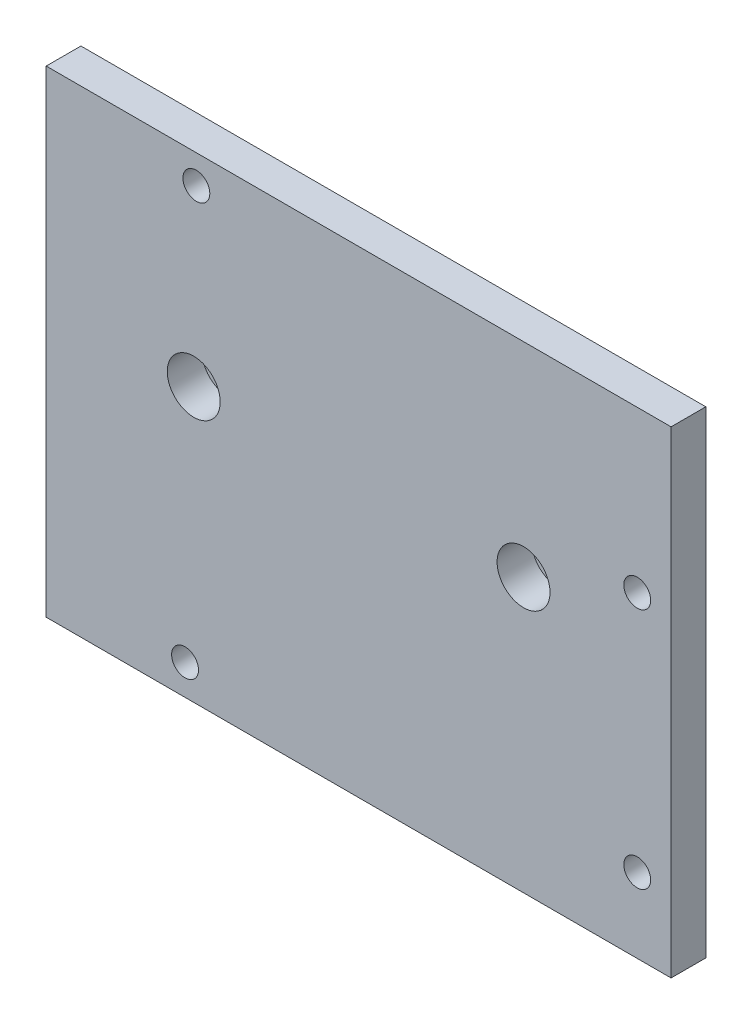
ISO-10303-21;
HEADER;
FILE_DESCRIPTION(('STEP AP214'),'2;1');
FILE_NAME('part.step','',(''),(''),'','','');
FILE_SCHEMA(('AUTOMOTIVE_DESIGN { 1 0 10303 214 1 1 1 1 }'));
ENDSEC;
DATA;
#1=APPLICATION_CONTEXT('core data for automotive mechanical design processes');
#2=APPLICATION_PROTOCOL_DEFINITION('international standard','automotive_design',2000,#1);
#3=PRODUCT_CONTEXT('',#1,'mechanical');
#4=PRODUCT('Part','Part','',(#3));
#5=PRODUCT_RELATED_PRODUCT_CATEGORY('part','',(#4));
#6=PRODUCT_DEFINITION_FORMATION('','',#4);
#7=PRODUCT_DEFINITION_CONTEXT('part definition',#1,'design');
#8=PRODUCT_DEFINITION('design','',#6,#7);
#9=PRODUCT_DEFINITION_SHAPE('','',#8);
#10=(LENGTH_UNIT() NAMED_UNIT(*) SI_UNIT(.MILLI.,.METRE.));
#11=(NAMED_UNIT(*) PLANE_ANGLE_UNIT() SI_UNIT($,.RADIAN.));
#12=(NAMED_UNIT(*) SI_UNIT($,.STERADIAN.) SOLID_ANGLE_UNIT());
#13=UNCERTAINTY_MEASURE_WITH_UNIT(LENGTH_MEASURE(1.E-05),#10,'distance_accuracy_value','');
#14=(GEOMETRIC_REPRESENTATION_CONTEXT(3) GLOBAL_UNCERTAINTY_ASSIGNED_CONTEXT((#13)) GLOBAL_UNIT_ASSIGNED_CONTEXT((#10,
#11,#12)) REPRESENTATION_CONTEXT('',''));
#15=CARTESIAN_POINT('',(0.,0.,0.));
#16=DIRECTION('',(0.,0.,1.));
#17=DIRECTION('',(1.,0.,0.));
#18=AXIS2_PLACEMENT_3D('',#15,#16,#17);
#19=CARTESIAN_POINT('',(0.,0.,6.));
#20=DIRECTION('',(0.,0.,-1.));
#21=DIRECTION('',(-1.,0.,0.));
#22=AXIS2_PLACEMENT_3D('',#19,#20,#21);
#23=PLANE('',#22);
#24=CARTESIAN_POINT('',(19.,0.,6.));
#25=DIRECTION('',(0.,0.,1.));
#26=DIRECTION('',(1.,0.,0.));
#27=AXIS2_PLACEMENT_3D('',#24,#25,#26);
#28=CIRCLE('',#27,1.55);
#29=CARTESIAN_POINT('',(20.55,0.,6.));
#30=VERTEX_POINT('',#29);
#31=EDGE_CURVE('E179',#30,#30,#28,.T.);
#32=ORIENTED_EDGE('',*,*,#31,.F.);
#33=EDGE_LOOP('',(#32));
#34=FACE_BOUND('',#33,.T.);
#35=CARTESIAN_POINT('',(19.,0.,6.));
#36=DIRECTION('',(0.,0.,1.));
#37=DIRECTION('',(1.,0.,0.));
#38=AXIS2_PLACEMENT_3D('',#35,#36,#37);
#39=CIRCLE('',#38,3.05);
#40=CARTESIAN_POINT('',(22.05,0.,6.));
#41=VERTEX_POINT('',#40);
#42=EDGE_CURVE('E167',#41,#41,#39,.T.);
#43=ORIENTED_EDGE('',*,*,#42,.T.);
#44=EDGE_LOOP('',(#43));
#45=FACE_BOUND('',#44,.T.);
#46=ADVANCED_FACE('F34',(#34,#45),#23,.F.);
#47=CARTESIAN_POINT('',(-19.,0.,6.));
#48=DIRECTION('',(0.,0.,1.));
#49=DIRECTION('',(1.,0.,0.));
#50=AXIS2_PLACEMENT_3D('',#47,#48,#49);
#51=CIRCLE('',#50,1.55);
#52=CARTESIAN_POINT('',(-17.45,0.,6.));
#53=VERTEX_POINT('',#52);
#54=EDGE_CURVE('E185',#53,#53,#51,.T.);
#55=ORIENTED_EDGE('',*,*,#54,.F.);
#56=EDGE_LOOP('',(#55));
#57=FACE_BOUND('',#56,.T.);
#58=CARTESIAN_POINT('',(-19.,0.,6.));
#59=DIRECTION('',(0.,0.,1.));
#60=DIRECTION('',(1.,0.,0.));
#61=AXIS2_PLACEMENT_3D('',#58,#59,#60);
#62=CIRCLE('',#61,3.05);
#63=CARTESIAN_POINT('',(-15.95,0.,6.));
#64=VERTEX_POINT('',#63);
#65=EDGE_CURVE('E170',#64,#64,#62,.T.);
#66=ORIENTED_EDGE('',*,*,#65,.T.);
#67=EDGE_LOOP('',(#66));
#68=FACE_BOUND('',#67,.T.);
#69=ADVANCED_FACE('F234',(#57,#68),#23,.F.);
#70=CARTESIAN_POINT('',(0.,0.,0.));
#71=DIRECTION('',(0.,0.,-1.));
#72=DIRECTION('',(-1.,0.,0.));
#73=AXIS2_PLACEMENT_3D('',#70,#71,#72);
#74=PLANE('',#73);
#75=CARTESIAN_POINT('',(-19.,0.,0.));
#76=DIRECTION('',(0.,0.,1.));
#77=DIRECTION('',(1.,0.,0.));
#78=AXIS2_PLACEMENT_3D('',#75,#76,#77);
#79=CIRCLE('',#78,1.55);
#80=CARTESIAN_POINT('',(-17.45,0.,0.));
#81=VERTEX_POINT('',#80);
#82=EDGE_CURVE('E182',#81,#81,#79,.T.);
#83=ORIENTED_EDGE('',*,*,#82,.T.);
#84=EDGE_LOOP('',(#83));
#85=FACE_BOUND('',#84,.T.);
#86=DIRECTION('',(0.,1.,0.));
#87=VECTOR('',#86,1.);
#88=CARTESIAN_POINT('',(29.,-6.,0.));
#89=LINE('',#88,#87);
#90=CARTESIAN_POINT('',(29.,-6.,0.));
#91=VERTEX_POINT('',#90);
#92=CARTESIAN_POINT('',(29.,6.,0.));
#93=VERTEX_POINT('',#92);
#94=EDGE_CURVE('E188',#91,#93,#89,.T.);
#95=ORIENTED_EDGE('',*,*,#94,.F.);
#96=DIRECTION('',(1.,0.,0.));
#97=VECTOR('',#96,1.);
#98=CARTESIAN_POINT('',(-29.,-6.,0.));
#99=LINE('',#98,#97);
#100=CARTESIAN_POINT('',(-29.,-6.,0.));
#101=VERTEX_POINT('',#100);
#102=EDGE_CURVE('E72',#101,#91,#99,.T.);
#103=ORIENTED_EDGE('',*,*,#102,.F.);
#104=DIRECTION('',(0.,-1.,0.));
#105=VECTOR('',#104,1.);
#106=CARTESIAN_POINT('',(-29.,-6.,0.));
#107=LINE('',#106,#105);
#108=CARTESIAN_POINT('',(-29.,6.,0.));
#109=VERTEX_POINT('',#108);
#110=EDGE_CURVE('E67',#109,#101,#107,.T.);
#111=ORIENTED_EDGE('',*,*,#110,.F.);
#112=DIRECTION('',(-1.,0.,0.));
#113=VECTOR('',#112,1.);
#114=CARTESIAN_POINT('',(-29.,6.,0.));
#115=LINE('',#114,#113);
#116=EDGE_CURVE('E204',#93,#109,#115,.T.);
#117=ORIENTED_EDGE('',*,*,#116,.F.);
#118=EDGE_LOOP('',(#95,#103,#111,#117));
#119=FACE_BOUND('',#118,.T.);
#120=CARTESIAN_POINT('',(19.,0.,0.));
#121=DIRECTION('',(0.,0.,1.));
#122=DIRECTION('',(1.,0.,0.));
#123=AXIS2_PLACEMENT_3D('',#120,#121,#122);
#124=CIRCLE('',#123,1.55);
#125=CARTESIAN_POINT('',(20.55,0.,0.));
#126=VERTEX_POINT('',#125);
#127=EDGE_CURVE('E118',#126,#126,#124,.T.);
#128=ORIENTED_EDGE('',*,*,#127,.T.);
#129=EDGE_LOOP('',(#128));
#130=FACE_BOUND('',#129,.T.);
#131=ADVANCED_FACE('F212',(#85,#119,#130),#74,.T.);
#132=CARTESIAN_POINT('',(29.,-6.,6.));
#133=DIRECTION('',(-1.,0.,0.));
#134=DIRECTION('',(0.,0.,1.));
#135=AXIS2_PLACEMENT_3D('',#132,#133,#134);
#136=PLANE('',#135);
#137=ORIENTED_EDGE('',*,*,#94,.T.);
#138=DIRECTION('',(0.,0.,-1.));
#139=VECTOR('',#138,1.);
#140=CARTESIAN_POINT('',(29.,6.,6.));
#141=LINE('',#140,#139);
#142=CARTESIAN_POINT('',(29.,6.,6.));
#143=VERTEX_POINT('',#142);
#144=EDGE_CURVE('E11',#143,#93,#141,.T.);
#145=ORIENTED_EDGE('',*,*,#144,.F.);
#146=DIRECTION('',(0.,1.,0.));
#147=VECTOR('',#146,1.);
#148=CARTESIAN_POINT('',(29.,-6.,6.));
#149=LINE('',#148,#147);
#150=CARTESIAN_POINT('',(29.,-6.,6.));
#151=VERTEX_POINT('',#150);
#152=EDGE_CURVE('E191',#151,#143,#149,.T.);
#153=ORIENTED_EDGE('',*,*,#152,.F.);
#154=DIRECTION('',(0.,0.,-1.));
#155=VECTOR('',#154,1.);
#156=CARTESIAN_POINT('',(29.,-6.,6.));
#157=LINE('',#156,#155);
#158=EDGE_CURVE('E201',#151,#91,#157,.T.);
#159=ORIENTED_EDGE('',*,*,#158,.T.);
#160=EDGE_LOOP('',(#137,#145,#153,#159));
#161=FACE_BOUND('',#160,.T.);
#162=ADVANCED_FACE('F36',(#161),#136,.F.);
#163=CARTESIAN_POINT('',(-29.,6.,6.));
#164=DIRECTION('',(0.,-1.,0.));
#165=DIRECTION('',(0.,0.,-1.));
#166=AXIS2_PLACEMENT_3D('',#163,#164,#165);
#167=PLANE('',#166);
#168=ORIENTED_EDGE('',*,*,#116,.T.);
#169=DIRECTION('',(0.,0.,-1.));
#170=VECTOR('',#169,1.);
#171=CARTESIAN_POINT('',(-29.,6.,6.));
#172=LINE('',#171,#170);
#173=CARTESIAN_POINT('',(-29.,6.,6.));
#174=VERTEX_POINT('',#173);
#175=EDGE_CURVE('E43',#174,#109,#172,.T.);
#176=ORIENTED_EDGE('',*,*,#175,.F.);
#177=DIRECTION('',(-1.,0.,0.));
#178=VECTOR('',#177,1.);
#179=CARTESIAN_POINT('',(-29.,6.,6.));
#180=LINE('',#179,#178);
#181=EDGE_CURVE('E77',#143,#174,#180,.T.);
#182=ORIENTED_EDGE('',*,*,#181,.F.);
#183=ORIENTED_EDGE('',*,*,#144,.T.);
#184=EDGE_LOOP('',(#168,#176,#182,#183));
#185=FACE_BOUND('',#184,.T.);
#186=ADVANCED_FACE('F251',(#185),#167,.F.);
#187=CARTESIAN_POINT('',(-29.,-6.,6.));
#188=DIRECTION('',(1.,0.,0.));
#189=DIRECTION('',(0.,0.,-1.));
#190=AXIS2_PLACEMENT_3D('',#187,#188,#189);
#191=PLANE('',#190);
#192=ORIENTED_EDGE('',*,*,#110,.T.);
#193=DIRECTION('',(0.,0.,-1.));
#194=VECTOR('',#193,1.);
#195=CARTESIAN_POINT('',(-29.,-6.,6.));
#196=LINE('',#195,#194);
#197=CARTESIAN_POINT('',(-29.,-6.,6.));
#198=VERTEX_POINT('',#197);
#199=EDGE_CURVE('E51',#198,#101,#196,.T.);
#200=ORIENTED_EDGE('',*,*,#199,.F.);
#201=DIRECTION('',(0.,-1.,0.));
#202=VECTOR('',#201,1.);
#203=CARTESIAN_POINT('',(-29.,-6.,6.));
#204=LINE('',#203,#202);
#205=EDGE_CURVE('E195',#174,#198,#204,.T.);
#206=ORIENTED_EDGE('',*,*,#205,.F.);
#207=ORIENTED_EDGE('',*,*,#175,.T.);
#208=EDGE_LOOP('',(#192,#200,#206,#207));
#209=FACE_BOUND('',#208,.T.);
#210=ADVANCED_FACE('F209',(#209),#191,.F.);
#211=CARTESIAN_POINT('',(-29.,-6.,6.));
#212=DIRECTION('',(0.,1.,0.));
#213=DIRECTION('',(0.,0.,1.));
#214=AXIS2_PLACEMENT_3D('',#211,#212,#213);
#215=PLANE('',#214);
#216=ORIENTED_EDGE('',*,*,#102,.T.);
#217=ORIENTED_EDGE('',*,*,#158,.F.);
#218=DIRECTION('',(1.,0.,0.));
#219=VECTOR('',#218,1.);
#220=CARTESIAN_POINT('',(-29.,-6.,6.));
#221=LINE('',#220,#219);
#222=EDGE_CURVE('E198',#198,#151,#221,.T.);
#223=ORIENTED_EDGE('',*,*,#222,.F.);
#224=ORIENTED_EDGE('',*,*,#199,.T.);
#225=EDGE_LOOP('',(#216,#217,#223,#224));
#226=FACE_BOUND('',#225,.T.);
#227=ADVANCED_FACE('F215',(#226),#215,.F.);
#228=CARTESIAN_POINT('',(-19.,0.,6.));
#229=DIRECTION('',(0.,0.,-1.));
#230=DIRECTION('',(-1.,0.,0.));
#231=AXIS2_PLACEMENT_3D('',#228,#229,#230);
#232=CYLINDRICAL_SURFACE('',#231,1.55);
#233=ORIENTED_EDGE('',*,*,#54,.T.);
#234=EDGE_LOOP('',(#233));
#235=FACE_BOUND('',#234,.T.);
#236=ORIENTED_EDGE('',*,*,#82,.F.);
#237=EDGE_LOOP('',(#236));
#238=FACE_BOUND('',#237,.T.);
#239=ADVANCED_FACE('F227',(#235,#238),#232,.F.);
#240=CARTESIAN_POINT('',(19.,0.,6.));
#241=DIRECTION('',(0.,0.,-1.));
#242=DIRECTION('',(-1.,0.,0.));
#243=AXIS2_PLACEMENT_3D('',#240,#241,#242);
#244=CYLINDRICAL_SURFACE('',#243,1.55);
#245=ORIENTED_EDGE('',*,*,#31,.T.);
#246=EDGE_LOOP('',(#245));
#247=FACE_BOUND('',#246,.T.);
#248=ORIENTED_EDGE('',*,*,#127,.F.);
#249=EDGE_LOOP('',(#248));
#250=FACE_BOUND('',#249,.T.);
#251=ADVANCED_FACE('F219',(#247,#250),#244,.F.);
#252=CARTESIAN_POINT('',(0.,0.,6.));
#253=DIRECTION('',(0.,0.,1.));
#254=DIRECTION('',(1.,0.,0.));
#255=AXIS2_PLACEMENT_3D('',#252,#253,#254);
#256=PLANE('',#255);
#257=DIRECTION('',(0.,-1.,0.));
#258=VECTOR('',#257,1.);
#259=CARTESIAN_POINT('',(36.,0.,6.));
#260=LINE('',#259,#258);
#261=CARTESIAN_POINT('',(36.,23.5,6.));
#262=VERTEX_POINT('',#261);
#263=CARTESIAN_POINT('',(36.,-31.5,6.));
#264=VERTEX_POINT('',#263);
#265=EDGE_CURVE('E113',#262,#264,#260,.T.);
#266=ORIENTED_EDGE('',*,*,#265,.T.);
#267=DIRECTION('',(1.,0.,0.));
#268=VECTOR('',#267,1.);
#269=CARTESIAN_POINT('',(0.,-31.5,6.));
#270=LINE('',#269,#268);
#271=CARTESIAN_POINT('',(-36.,-31.5,6.));
#272=VERTEX_POINT('',#271);
#273=EDGE_CURVE('E164',#272,#264,#270,.T.);
#274=ORIENTED_EDGE('',*,*,#273,.F.);
#275=DIRECTION('',(0.,-1.,0.));
#276=VECTOR('',#275,1.);
#277=CARTESIAN_POINT('',(-36.,0.,6.));
#278=LINE('',#277,#276);
#279=CARTESIAN_POINT('',(-36.,23.5,6.));
#280=VERTEX_POINT('',#279);
#281=EDGE_CURVE('E161',#280,#272,#278,.T.);
#282=ORIENTED_EDGE('',*,*,#281,.F.);
#283=DIRECTION('',(1.,0.,0.));
#284=VECTOR('',#283,1.);
#285=CARTESIAN_POINT('',(0.,23.5,6.));
#286=LINE('',#285,#284);
#287=EDGE_CURVE('E159',#280,#262,#286,.T.);
#288=ORIENTED_EDGE('',*,*,#287,.T.);
#289=EDGE_LOOP('',(#266,#274,#282,#288));
#290=FACE_BOUND('',#289,.T.);
#291=CARTESIAN_POINT('',(32.1,5.,6.));
#292=DIRECTION('',(0.,0.,1.));
#293=DIRECTION('',(1.,0.,0.));
#294=AXIS2_PLACEMENT_3D('',#291,#292,#293);
#295=CIRCLE('',#294,1.54999999999999);
#296=CARTESIAN_POINT('',(33.65,5.,6.));
#297=VERTEX_POINT('',#296);
#298=EDGE_CURVE('E155',#297,#297,#295,.T.);
#299=ORIENTED_EDGE('',*,*,#298,.T.);
#300=EDGE_LOOP('',(#299));
#301=FACE_BOUND('',#300,.T.);
#302=CARTESIAN_POINT('',(-20.,-28.,6.));
#303=DIRECTION('',(0.,0.,1.));
#304=DIRECTION('',(1.,0.,0.));
#305=AXIS2_PLACEMENT_3D('',#302,#303,#304);
#306=CIRCLE('',#305,1.55);
#307=CARTESIAN_POINT('',(-18.45,-28.,6.));
#308=VERTEX_POINT('',#307);
#309=EDGE_CURVE('E152',#308,#308,#306,.T.);
#310=ORIENTED_EDGE('',*,*,#309,.T.);
#311=EDGE_LOOP('',(#310));
#312=FACE_BOUND('',#311,.T.);
#313=CARTESIAN_POINT('',(-18.7,20.2,6.));
#314=DIRECTION('',(0.,0.,1.));
#315=DIRECTION('',(1.,0.,0.));
#316=AXIS2_PLACEMENT_3D('',#313,#314,#315);
#317=CIRCLE('',#316,1.55);
#318=CARTESIAN_POINT('',(-17.15,20.2,6.));
#319=VERTEX_POINT('',#318);
#320=EDGE_CURVE('E149',#319,#319,#317,.T.);
#321=ORIENTED_EDGE('',*,*,#320,.T.);
#322=EDGE_LOOP('',(#321));
#323=FACE_BOUND('',#322,.T.);
#324=CARTESIAN_POINT('',(32.1,-22.9,6.));
#325=DIRECTION('',(0.,0.,1.));
#326=DIRECTION('',(1.,0.,0.));
#327=AXIS2_PLACEMENT_3D('',#324,#325,#326);
#328=CIRCLE('',#327,1.55);
#329=CARTESIAN_POINT('',(33.65,-22.9,6.));
#330=VERTEX_POINT('',#329);
#331=EDGE_CURVE('E146',#330,#330,#328,.T.);
#332=ORIENTED_EDGE('',*,*,#331,.T.);
#333=EDGE_LOOP('',(#332));
#334=FACE_BOUND('',#333,.T.);
#335=ORIENTED_EDGE('',*,*,#222,.T.);
#336=ORIENTED_EDGE('',*,*,#152,.T.);
#337=ORIENTED_EDGE('',*,*,#181,.T.);
#338=ORIENTED_EDGE('',*,*,#205,.T.);
#339=EDGE_LOOP('',(#335,#336,#337,#338));
#340=FACE_BOUND('',#339,.T.);
#341=ADVANCED_FACE('F217',(#290,#301,#312,#323,#334,#340),#256,.F.);
#342=CARTESIAN_POINT('',(36.,0.,10.));
#343=DIRECTION('',(1.,0.,0.));
#344=DIRECTION('',(0.,1.,0.));
#345=AXIS2_PLACEMENT_3D('',#342,#343,#344);
#346=PLANE('',#345);
#347=ORIENTED_EDGE('',*,*,#265,.F.);
#348=DIRECTION('',(0.,0.,-1.));
#349=VECTOR('',#348,1.);
#350=CARTESIAN_POINT('',(36.,23.5,10.));
#351=LINE('',#350,#349);
#352=CARTESIAN_POINT('',(36.,23.5,10.));
#353=VERTEX_POINT('',#352);
#354=EDGE_CURVE('E108',#353,#262,#351,.T.);
#355=ORIENTED_EDGE('',*,*,#354,.F.);
#356=DIRECTION('',(0.,-1.,0.));
#357=VECTOR('',#356,1.);
#358=CARTESIAN_POINT('',(36.,0.,10.));
#359=LINE('',#358,#357);
#360=CARTESIAN_POINT('',(36.,-31.5,10.));
#361=VERTEX_POINT('',#360);
#362=EDGE_CURVE('E111',#353,#361,#359,.T.);
#363=ORIENTED_EDGE('',*,*,#362,.T.);
#364=DIRECTION('',(0.,0.,-1.));
#365=VECTOR('',#364,1.);
#366=CARTESIAN_POINT('',(36.,-31.5,10.));
#367=LINE('',#366,#365);
#368=EDGE_CURVE('E145',#361,#264,#367,.T.);
#369=ORIENTED_EDGE('',*,*,#368,.T.);
#370=EDGE_LOOP('',(#347,#355,#363,#369));
#371=FACE_BOUND('',#370,.T.);
#372=ADVANCED_FACE('F110',(#371),#346,.T.);
#373=CARTESIAN_POINT('',(0.,23.5,10.));
#374=DIRECTION('',(0.,1.,0.));
#375=DIRECTION('',(0.,0.,1.));
#376=AXIS2_PLACEMENT_3D('',#373,#374,#375);
#377=PLANE('',#376);
#378=ORIENTED_EDGE('',*,*,#287,.F.);
#379=DIRECTION('',(0.,0.,-1.));
#380=VECTOR('',#379,1.);
#381=CARTESIAN_POINT('',(-36.,23.5,10.));
#382=LINE('',#381,#380);
#383=CARTESIAN_POINT('',(-36.,23.5,10.));
#384=VERTEX_POINT('',#383);
#385=EDGE_CURVE('E119',#384,#280,#382,.T.);
#386=ORIENTED_EDGE('',*,*,#385,.F.);
#387=DIRECTION('',(1.,0.,0.));
#388=VECTOR('',#387,1.);
#389=CARTESIAN_POINT('',(0.,23.5,10.));
#390=LINE('',#389,#388);
#391=EDGE_CURVE('E126',#384,#353,#390,.T.);
#392=ORIENTED_EDGE('',*,*,#391,.T.);
#393=ORIENTED_EDGE('',*,*,#354,.T.);
#394=EDGE_LOOP('',(#378,#386,#392,#393));
#395=FACE_BOUND('',#394,.T.);
#396=ADVANCED_FACE('F131',(#395),#377,.T.);
#397=CARTESIAN_POINT('',(-36.,0.,10.));
#398=DIRECTION('',(1.,0.,0.));
#399=DIRECTION('',(0.,1.,0.));
#400=AXIS2_PLACEMENT_3D('',#397,#398,#399);
#401=PLANE('',#400);
#402=ORIENTED_EDGE('',*,*,#281,.T.);
#403=DIRECTION('',(0.,0.,-1.));
#404=VECTOR('',#403,1.);
#405=CARTESIAN_POINT('',(-36.,-31.5,10.));
#406=LINE('',#405,#404);
#407=CARTESIAN_POINT('',(-36.,-31.5,10.));
#408=VERTEX_POINT('',#407);
#409=EDGE_CURVE('E175',#408,#272,#406,.T.);
#410=ORIENTED_EDGE('',*,*,#409,.F.);
#411=DIRECTION('',(0.,-1.,0.));
#412=VECTOR('',#411,1.);
#413=CARTESIAN_POINT('',(-36.,0.,10.));
#414=LINE('',#413,#412);
#415=EDGE_CURVE('E133',#384,#408,#414,.T.);
#416=ORIENTED_EDGE('',*,*,#415,.F.);
#417=ORIENTED_EDGE('',*,*,#385,.T.);
#418=EDGE_LOOP('',(#402,#410,#416,#417));
#419=FACE_BOUND('',#418,.T.);
#420=ADVANCED_FACE('F324',(#419),#401,.F.);
#421=CARTESIAN_POINT('',(19.,0.,10.));
#422=DIRECTION('',(0.,0.,-1.));
#423=DIRECTION('',(-1.,0.,0.));
#424=AXIS2_PLACEMENT_3D('',#421,#422,#423);
#425=CYLINDRICAL_SURFACE('',#424,3.05);
#426=CARTESIAN_POINT('',(19.,0.,10.));
#427=DIRECTION('',(0.,0.,1.));
#428=DIRECTION('',(1.,0.,0.));
#429=AXIS2_PLACEMENT_3D('',#426,#427,#428);
#430=CIRCLE('',#429,3.05);
#431=CARTESIAN_POINT('',(22.05,0.,10.));
#432=VERTEX_POINT('',#431);
#433=EDGE_CURVE('E139',#432,#432,#430,.T.);
#434=ORIENTED_EDGE('',*,*,#433,.T.);
#435=EDGE_LOOP('',(#434));
#436=FACE_BOUND('',#435,.T.);
#437=ORIENTED_EDGE('',*,*,#42,.F.);
#438=EDGE_LOOP('',(#437));
#439=FACE_BOUND('',#438,.T.);
#440=ADVANCED_FACE('F333',(#436,#439),#425,.F.);
#441=CARTESIAN_POINT('',(0.,-31.5,10.));
#442=DIRECTION('',(0.,1.,0.));
#443=DIRECTION('',(0.,0.,1.));
#444=AXIS2_PLACEMENT_3D('',#441,#442,#443);
#445=PLANE('',#444);
#446=ORIENTED_EDGE('',*,*,#273,.T.);
#447=ORIENTED_EDGE('',*,*,#368,.F.);
#448=DIRECTION('',(1.,0.,0.));
#449=VECTOR('',#448,1.);
#450=CARTESIAN_POINT('',(0.,-31.5,10.));
#451=LINE('',#450,#449);
#452=EDGE_CURVE('E127',#408,#361,#451,.T.);
#453=ORIENTED_EDGE('',*,*,#452,.F.);
#454=ORIENTED_EDGE('',*,*,#409,.T.);
#455=EDGE_LOOP('',(#446,#447,#453,#454));
#456=FACE_BOUND('',#455,.T.);
#457=ADVANCED_FACE('F343',(#456),#445,.F.);
#458=CARTESIAN_POINT('',(32.1,5.,10.));
#459=DIRECTION('',(0.,0.,-1.));
#460=DIRECTION('',(-1.,0.,0.));
#461=AXIS2_PLACEMENT_3D('',#458,#459,#460);
#462=CYLINDRICAL_SURFACE('',#461,1.54999999999999);
#463=CARTESIAN_POINT('',(32.1,5.,10.));
#464=DIRECTION('',(0.,0.,1.));
#465=DIRECTION('',(1.,0.,0.));
#466=AXIS2_PLACEMENT_3D('',#463,#464,#465);
#467=CIRCLE('',#466,1.54999999999999);
#468=CARTESIAN_POINT('',(33.65,5.,10.));
#469=VERTEX_POINT('',#468);
#470=EDGE_CURVE('E129',#469,#469,#467,.T.);
#471=ORIENTED_EDGE('',*,*,#470,.T.);
#472=EDGE_LOOP('',(#471));
#473=FACE_BOUND('',#472,.T.);
#474=ORIENTED_EDGE('',*,*,#298,.F.);
#475=EDGE_LOOP('',(#474));
#476=FACE_BOUND('',#475,.T.);
#477=ADVANCED_FACE('F353',(#473,#476),#462,.F.);
#478=CARTESIAN_POINT('',(-20.,-28.,10.));
#479=DIRECTION('',(0.,0.,-1.));
#480=DIRECTION('',(-1.,0.,0.));
#481=AXIS2_PLACEMENT_3D('',#478,#479,#480);
#482=CYLINDRICAL_SURFACE('',#481,1.55);
#483=CARTESIAN_POINT('',(-20.,-28.,10.));
#484=DIRECTION('',(0.,0.,1.));
#485=DIRECTION('',(1.,0.,0.));
#486=AXIS2_PLACEMENT_3D('',#483,#484,#485);
#487=CIRCLE('',#486,1.55);
#488=CARTESIAN_POINT('',(-18.45,-28.,10.));
#489=VERTEX_POINT('',#488);
#490=EDGE_CURVE('E427',#489,#489,#487,.T.);
#491=ORIENTED_EDGE('',*,*,#490,.T.);
#492=EDGE_LOOP('',(#491));
#493=FACE_BOUND('',#492,.T.);
#494=ORIENTED_EDGE('',*,*,#309,.F.);
#495=EDGE_LOOP('',(#494));
#496=FACE_BOUND('',#495,.T.);
#497=ADVANCED_FACE('F363',(#493,#496),#482,.F.);
#498=CARTESIAN_POINT('',(-18.7,20.2,10.));
#499=DIRECTION('',(0.,0.,-1.));
#500=DIRECTION('',(-1.,0.,0.));
#501=AXIS2_PLACEMENT_3D('',#498,#499,#500);
#502=CYLINDRICAL_SURFACE('',#501,1.55);
#503=CARTESIAN_POINT('',(-18.7,20.2,10.));
#504=DIRECTION('',(0.,0.,1.));
#505=DIRECTION('',(1.,0.,0.));
#506=AXIS2_PLACEMENT_3D('',#503,#504,#505);
#507=CIRCLE('',#506,1.55);
#508=CARTESIAN_POINT('',(-17.15,20.2,10.));
#509=VERTEX_POINT('',#508);
#510=EDGE_CURVE('E423',#509,#509,#507,.T.);
#511=ORIENTED_EDGE('',*,*,#510,.T.);
#512=EDGE_LOOP('',(#511));
#513=FACE_BOUND('',#512,.T.);
#514=ORIENTED_EDGE('',*,*,#320,.F.);
#515=EDGE_LOOP('',(#514));
#516=FACE_BOUND('',#515,.T.);
#517=ADVANCED_FACE('F373',(#513,#516),#502,.F.);
#518=CARTESIAN_POINT('',(32.1,-22.9,10.));
#519=DIRECTION('',(0.,0.,-1.));
#520=DIRECTION('',(-1.,0.,0.));
#521=AXIS2_PLACEMENT_3D('',#518,#519,#520);
#522=CYLINDRICAL_SURFACE('',#521,1.55);
#523=CARTESIAN_POINT('',(32.1,-22.9,10.));
#524=DIRECTION('',(0.,0.,1.));
#525=DIRECTION('',(1.,0.,0.));
#526=AXIS2_PLACEMENT_3D('',#523,#524,#525);
#527=CIRCLE('',#526,1.55);
#528=CARTESIAN_POINT('',(33.65,-22.9,10.));
#529=VERTEX_POINT('',#528);
#530=EDGE_CURVE('E173',#529,#529,#527,.T.);
#531=ORIENTED_EDGE('',*,*,#530,.T.);
#532=EDGE_LOOP('',(#531));
#533=FACE_BOUND('',#532,.T.);
#534=ORIENTED_EDGE('',*,*,#331,.F.);
#535=EDGE_LOOP('',(#534));
#536=FACE_BOUND('',#535,.T.);
#537=ADVANCED_FACE('F383',(#533,#536),#522,.F.);
#538=CARTESIAN_POINT('',(-19.,0.,10.));
#539=DIRECTION('',(0.,0.,-1.));
#540=DIRECTION('',(-1.,0.,0.));
#541=AXIS2_PLACEMENT_3D('',#538,#539,#540);
#542=CYLINDRICAL_SURFACE('',#541,3.05);
#543=CARTESIAN_POINT('',(-19.,0.,10.));
#544=DIRECTION('',(0.,0.,1.));
#545=DIRECTION('',(1.,0.,0.));
#546=AXIS2_PLACEMENT_3D('',#543,#544,#545);
#547=CIRCLE('',#546,3.05);
#548=CARTESIAN_POINT('',(-15.95,0.,10.));
#549=VERTEX_POINT('',#548);
#550=EDGE_CURVE('E142',#549,#549,#547,.T.);
#551=ORIENTED_EDGE('',*,*,#550,.T.);
#552=EDGE_LOOP('',(#551));
#553=FACE_BOUND('',#552,.T.);
#554=ORIENTED_EDGE('',*,*,#65,.F.);
#555=EDGE_LOOP('',(#554));
#556=FACE_BOUND('',#555,.T.);
#557=ADVANCED_FACE('F393',(#553,#556),#542,.F.);
#558=CARTESIAN_POINT('',(0.,0.,10.));
#559=DIRECTION('',(0.,0.,1.));
#560=DIRECTION('',(1.,0.,0.));
#561=AXIS2_PLACEMENT_3D('',#558,#559,#560);
#562=PLANE('',#561);
#563=ORIENTED_EDGE('',*,*,#530,.F.);
#564=EDGE_LOOP('',(#563));
#565=FACE_BOUND('',#564,.T.);
#566=ORIENTED_EDGE('',*,*,#510,.F.);
#567=EDGE_LOOP('',(#566));
#568=FACE_BOUND('',#567,.T.);
#569=ORIENTED_EDGE('',*,*,#490,.F.);
#570=EDGE_LOOP('',(#569));
#571=FACE_BOUND('',#570,.T.);
#572=ORIENTED_EDGE('',*,*,#470,.F.);
#573=EDGE_LOOP('',(#572));
#574=FACE_BOUND('',#573,.T.);
#575=ORIENTED_EDGE('',*,*,#362,.F.);
#576=ORIENTED_EDGE('',*,*,#391,.F.);
#577=ORIENTED_EDGE('',*,*,#415,.T.);
#578=ORIENTED_EDGE('',*,*,#452,.T.);
#579=EDGE_LOOP('',(#575,#576,#577,#578));
#580=FACE_BOUND('',#579,.T.);
#581=ORIENTED_EDGE('',*,*,#433,.F.);
#582=EDGE_LOOP('',(#581));
#583=FACE_BOUND('',#582,.T.);
#584=ORIENTED_EDGE('',*,*,#550,.F.);
#585=EDGE_LOOP('',(#584));
#586=FACE_BOUND('',#585,.T.);
#587=ADVANCED_FACE('F123',(#565,#568,#571,#574,#580,#583,#586),#562,.T.);
#588=CLOSED_SHELL('',(#46,#69,#131,#162,#186,#210,#227,#239,#251,#341,#372,#396,#420,#440,#457,
#477,#497,#517,#537,#557,#587));
#589=MANIFOLD_SOLID_BREP('B2',#588);
#590=ADVANCED_BREP_SHAPE_REPRESENTATION('',(#18,#589),#14);
#591=SHAPE_DEFINITION_REPRESENTATION(#9,#590);
ENDSEC;
END-ISO-10303-21;
